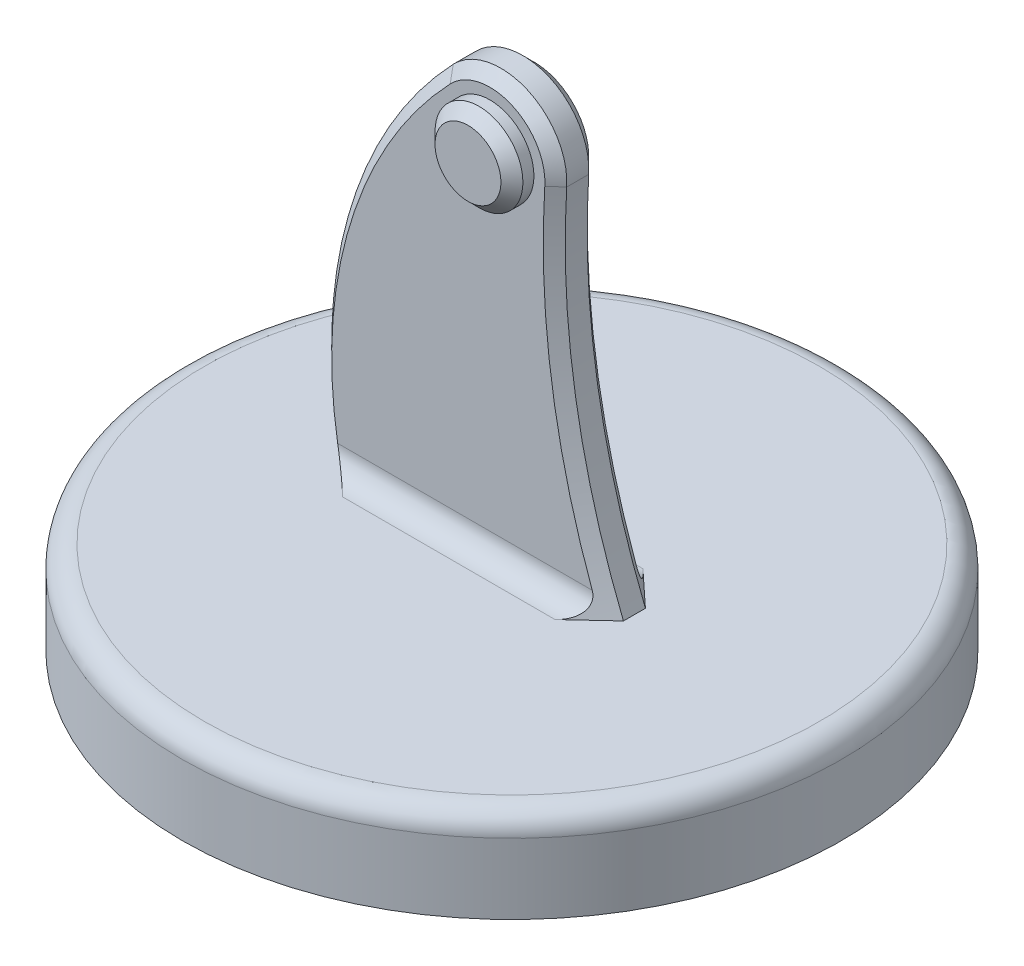
ISO-10303-21;
HEADER;
FILE_DESCRIPTION(('STEP AP214'),'2;1');
FILE_NAME('part.step','',(''),(''),'','','');
FILE_SCHEMA(('AUTOMOTIVE_DESIGN { 1 0 10303 214 1 1 1 1 }'));
ENDSEC;
DATA;
#1=APPLICATION_CONTEXT('core data for automotive mechanical design processes');
#2=APPLICATION_PROTOCOL_DEFINITION('international standard','automotive_design',2000,#1);
#3=PRODUCT_CONTEXT('',#1,'mechanical');
#4=PRODUCT('Part','Part','',(#3));
#5=PRODUCT_RELATED_PRODUCT_CATEGORY('part','',(#4));
#6=PRODUCT_DEFINITION_FORMATION('','',#4);
#7=PRODUCT_DEFINITION_CONTEXT('part definition',#1,'design');
#8=PRODUCT_DEFINITION('design','',#6,#7);
#9=PRODUCT_DEFINITION_SHAPE('','',#8);
#10=(LENGTH_UNIT() NAMED_UNIT(*) SI_UNIT(.MILLI.,.METRE.));
#11=(NAMED_UNIT(*) PLANE_ANGLE_UNIT() SI_UNIT($,.RADIAN.));
#12=(NAMED_UNIT(*) SI_UNIT($,.STERADIAN.) SOLID_ANGLE_UNIT());
#13=UNCERTAINTY_MEASURE_WITH_UNIT(LENGTH_MEASURE(1.E-05),#10,'distance_accuracy_value','');
#14=(GEOMETRIC_REPRESENTATION_CONTEXT(3) GLOBAL_UNCERTAINTY_ASSIGNED_CONTEXT((#13)) GLOBAL_UNIT_ASSIGNED_CONTEXT((#10,
#11,#12)) REPRESENTATION_CONTEXT('',''));
#15=CARTESIAN_POINT('',(0.,0.,0.));
#16=DIRECTION('',(0.,0.,1.));
#17=DIRECTION('',(1.,0.,0.));
#18=AXIS2_PLACEMENT_3D('',#15,#16,#17);
#19=CARTESIAN_POINT('',(0.,20.,0.));
#20=DIRECTION('',(0.,1.,0.));
#21=DIRECTION('',(0.,0.,1.));
#22=AXIS2_PLACEMENT_3D('',#19,#20,#21);
#23=PLANE('',#22);
#24=CARTESIAN_POINT('',(0.,20.,0.));
#25=DIRECTION('',(0.,1.,0.));
#26=DIRECTION('',(0.,0.,1.));
#27=AXIS2_PLACEMENT_3D('',#24,#25,#26);
#28=CIRCLE('',#27,70.);
#29=CARTESIAN_POINT('',(0.,20.,70.));
#30=VERTEX_POINT('',#29);
#31=EDGE_CURVE('E384',#30,#30,#28,.T.);
#32=ORIENTED_EDGE('',*,*,#31,.T.);
#33=EDGE_LOOP('',(#32));
#34=FACE_BOUND('',#33,.T.);
#35=DIRECTION('',(-1.,0.,0.));
#36=VECTOR('',#35,1.);
#37=CARTESIAN_POINT('',(0.,20.,10.));
#38=LINE('',#37,#36);
#39=CARTESIAN_POINT('',(19.8084097202197,20.,10.));
#40=VERTEX_POINT('',#39);
#41=CARTESIAN_POINT('',(-28.5347400447898,20.,10.));
#42=VERTEX_POINT('',#41);
#43=EDGE_CURVE('E137',#40,#42,#38,.T.);
#44=ORIENTED_EDGE('',*,*,#43,.T.);
#45=CARTESIAN_POINT('',(-28.5347400447898,20.,9.99999999999999));
#46=CARTESIAN_POINT('',(-29.390461949538,20.,9.16727790608721));
#47=CARTESIAN_POINT('',(-30.2458713230868,20.,8.33423473892486));
#48=CARTESIAN_POINT('',(-31.9561089872227,20.,6.6675526869515));
#49=CARTESIAN_POINT('',(-32.8109372780004,20.,5.83391380233608));
#50=CARTESIAN_POINT('',(-34.5191891841924,20.,4.16693335697093));
#51=CARTESIAN_POINT('',(-35.372613344394,20.,3.33359235450626));
#52=CARTESIAN_POINT('',(-36.2257918410724,20.,2.50000000000007));
#53=B_SPLINE_CURVE_WITH_KNOTS('',3,(#45,#46,#47,#48,#49,#50,#51,#52),.UNSPECIFIED.,.F.,.F.,(4,2,
2,4),(0.,3.58206271115794,7.16412424671796,10.7425468249186),.UNSPECIFIED.);
#54=CARTESIAN_POINT('',(-36.2257918410724,20.,2.50000000000006));
#55=VERTEX_POINT('',#54);
#56=EDGE_CURVE('E133',#42,#55,#53,.T.);
#57=ORIENTED_EDGE('',*,*,#56,.T.);
#58=DIRECTION('',(0.,0.,-1.));
#59=VECTOR('',#58,1.);
#60=CARTESIAN_POINT('',(-36.2257918410724,20.,5.));
#61=LINE('',#60,#59);
#62=CARTESIAN_POINT('',(-36.2257918410724,20.,-2.49999999999989));
#63=VERTEX_POINT('',#62);
#64=EDGE_CURVE('E135',#55,#63,#61,.T.);
#65=ORIENTED_EDGE('',*,*,#64,.T.);
#66=CARTESIAN_POINT('',(-36.2257918410724,20.,-2.49999999999989));
#67=CARTESIAN_POINT('',(-35.372613344394,20.,-3.33359235450615));
#68=CARTESIAN_POINT('',(-34.5191891841923,20.,-4.16693335697088));
#69=CARTESIAN_POINT('',(-32.8109372780018,20.,-5.83391380233447));
#70=CARTESIAN_POINT('',(-31.9561089872258,20.,-6.66755268694828));
#71=CARTESIAN_POINT('',(-30.2458713230932,20.,-8.33423473891841));
#72=CARTESIAN_POINT('',(-29.390461949546,20.,-9.16727790607914));
#73=CARTESIAN_POINT('',(-28.5347400447995,20.,-9.99999999999032));
#74=B_SPLINE_CURVE_WITH_KNOTS('',3,(#66,#67,#68,#69,#70,#71,#72,#73),.UNSPECIFIED.,.F.,.F.,(4,2,
2,4),(0.,3.57842257820087,7.16048411375398,10.742546824905),.UNSPECIFIED.);
#75=CARTESIAN_POINT('',(-28.5347400447995,20.,-10.));
#76=VERTEX_POINT('',#75);
#77=EDGE_CURVE('E198',#63,#76,#74,.T.);
#78=ORIENTED_EDGE('',*,*,#77,.T.);
#79=DIRECTION('',(-1.,0.,0.));
#80=VECTOR('',#79,1.);
#81=CARTESIAN_POINT('',(25.1824752050034,20.,-10.));
#82=LINE('',#81,#80);
#83=CARTESIAN_POINT('',(19.8084097202194,20.,-10.));
#84=VERTEX_POINT('',#83);
#85=EDGE_CURVE('E338',#76,#84,#82,.F.);
#86=ORIENTED_EDGE('',*,*,#85,.T.);
#87=CARTESIAN_POINT('',(19.8084097202194,20.,-10.));
#88=CARTESIAN_POINT('',(20.7032286114693,20.,-9.16574365323037));
#89=CARTESIAN_POINT('',(21.5984643871195,20.,-8.3319343297424));
#90=CARTESIAN_POINT('',(23.3898068938442,20.,-6.6652533617684));
#91=CARTESIAN_POINT('',(24.2859136241592,20.,-5.83238171646611));
#92=CARTESIAN_POINT('',(26.0805990637616,20.,-4.16616784041946));
#93=CARTESIAN_POINT('',(26.979179359604,20.,-3.33282731858586));
#94=CARTESIAN_POINT('',(27.8782351753599,20.,-2.49999999999989));
#95=B_SPLINE_CURVE_WITH_KNOTS('',3,(#87,#88,#89,#90,#91,#92,#93,#94),.UNSPECIFIED.,.F.,.F.,(4,2,
2,4),(0.,3.67017170974667,7.34034022201683,11.016904082169),.UNSPECIFIED.);
#96=CARTESIAN_POINT('',(27.87823517536,20.,-2.49999999999989));
#97=VERTEX_POINT('',#96);
#98=EDGE_CURVE('E143',#84,#97,#95,.T.);
#99=ORIENTED_EDGE('',*,*,#98,.T.);
#100=DIRECTION('',(0.,0.,-1.));
#101=VECTOR('',#100,1.);
#102=CARTESIAN_POINT('',(27.87823517536,20.,5.));
#103=LINE('',#102,#101);
#104=CARTESIAN_POINT('',(27.87823517536,20.,2.50000000000006));
#105=VERTEX_POINT('',#104);
#106=EDGE_CURVE('E154',#97,#105,#103,.F.);
#107=ORIENTED_EDGE('',*,*,#106,.T.);
#108=CARTESIAN_POINT('',(27.8782351753599,20.,2.50000000000006));
#109=CARTESIAN_POINT('',(26.979179359604,20.,3.33282731858597));
#110=CARTESIAN_POINT('',(26.0805990637617,20.,4.16616784041951));
#111=CARTESIAN_POINT('',(24.2859136241594,20.,5.83238171646611));
#112=CARTESIAN_POINT('',(23.3898068938445,20.,6.6652533617684));
#113=CARTESIAN_POINT('',(21.5984643871198,20.,8.33193432974238));
#114=CARTESIAN_POINT('',(20.7032286114696,20.,9.16574365323035));
#115=CARTESIAN_POINT('',(19.8084097202197,20.,9.99999999999999));
#116=B_SPLINE_CURVE_WITH_KNOTS('',3,(#108,#109,#110,#111,#112,#113,#114,#115),.UNSPECIFIED.,.F.,
.F.,(4,2,2,4),(0.,3.67656386015191,7.34673237242202,11.0169040821687),.UNSPECIFIED.);
#117=EDGE_CURVE('E142',#105,#40,#116,.T.);
#118=ORIENTED_EDGE('',*,*,#117,.T.);
#119=EDGE_LOOP('',(#44,#57,#65,#78,#86,#99,#107,#118));
#120=FACE_BOUND('',#119,.T.);
#121=ADVANCED_FACE('F51',(#34,#120),#23,.T.);
#122=CARTESIAN_POINT('',(0.,-1.,0.));
#123=DIRECTION('',(0.,1.,0.));
#124=DIRECTION('',(0.,0.,1.));
#125=AXIS2_PLACEMENT_3D('',#122,#123,#124);
#126=CYLINDRICAL_SURFACE('',#125,75.);
#127=CARTESIAN_POINT('',(0.,15.,0.));
#128=DIRECTION('',(0.,1.,0.));
#129=DIRECTION('',(0.,0.,1.));
#130=AXIS2_PLACEMENT_3D('',#127,#128,#129);
#131=CIRCLE('',#130,75.);
#132=CARTESIAN_POINT('',(0.,15.,75.));
#133=VERTEX_POINT('',#132);
#134=EDGE_CURVE('E392',#133,#133,#131,.F.);
#135=ORIENTED_EDGE('',*,*,#134,.T.);
#136=EDGE_LOOP('',(#135));
#137=FACE_BOUND('',#136,.T.);
#138=CARTESIAN_POINT('',(0.,-1.,0.));
#139=DIRECTION('',(0.,1.,0.));
#140=DIRECTION('',(0.,0.,1.));
#141=AXIS2_PLACEMENT_3D('',#138,#139,#140);
#142=CIRCLE('',#141,75.);
#143=CARTESIAN_POINT('',(0.,-1.,75.));
#144=VERTEX_POINT('',#143);
#145=EDGE_CURVE('E379',#144,#144,#142,.T.);
#146=ORIENTED_EDGE('',*,*,#145,.T.);
#147=EDGE_LOOP('',(#146));
#148=FACE_BOUND('',#147,.T.);
#149=ADVANCED_FACE('F221',(#137,#148),#126,.T.);
#150=CARTESIAN_POINT('',(0.,-1.,0.));
#151=DIRECTION('',(0.,1.,0.));
#152=DIRECTION('',(0.,0.,1.));
#153=AXIS2_PLACEMENT_3D('',#150,#151,#152);
#154=PLANE('',#153);
#155=ORIENTED_EDGE('',*,*,#145,.F.);
#156=EDGE_LOOP('',(#155));
#157=FACE_BOUND('',#156,.T.);
#158=ADVANCED_FACE('F224',(#157),#154,.F.);
#159=CARTESIAN_POINT('',(0.,15.,0.));
#160=DIRECTION('',(0.,1.,0.));
#161=DIRECTION('',(0.,0.,1.));
#162=AXIS2_PLACEMENT_3D('',#159,#160,#161);
#163=TOROIDAL_SURFACE('',#162,70.,5.);
#164=ORIENTED_EDGE('',*,*,#134,.F.);
#165=EDGE_LOOP('',(#164));
#166=FACE_BOUND('',#165,.T.);
#167=ORIENTED_EDGE('',*,*,#31,.F.);
#168=EDGE_LOOP('',(#167));
#169=FACE_BOUND('',#168,.T.);
#170=ADVANCED_FACE('F442',(#166,#169),#163,.T.);
#171=CARTESIAN_POINT('',(61.4788080980091,41.3028437243492,5.));
#172=DIRECTION('',(0.,0.,-1.));
#173=DIRECTION('',(-1.,0.,0.));
#174=AXIS2_PLACEMENT_3D('',#171,#172,#173);
#175=CYLINDRICAL_SURFACE('',#174,100.);
#176=DIRECTION('',(0.,0.,-1.));
#177=VECTOR('',#176,1.);
#178=CARTESIAN_POINT('',(-10.8492014290604,110.358321695703,5.));
#179=LINE('',#178,#177);
#180=CARTESIAN_POINT('',(-10.8492014290604,110.358321695703,2.50000000000006));
#181=VERTEX_POINT('',#180);
#182=CARTESIAN_POINT('',(-10.8492014290604,110.358321695703,-2.49999999999989));
#183=VERTEX_POINT('',#182);
#184=EDGE_CURVE('E355',#181,#183,#179,.T.);
#185=ORIENTED_EDGE('',*,*,#184,.T.);
#186=CARTESIAN_POINT('',(61.4788080980091,41.3028437243492,-2.49999999999989));
#187=DIRECTION('',(0.,0.,-1.));
#188=DIRECTION('',(-1.,0.,0.));
#189=AXIS2_PLACEMENT_3D('',#186,#187,#188);
#190=CIRCLE('',#189,100.);
#191=EDGE_CURVE('E152',#183,#63,#190,.F.);
#192=ORIENTED_EDGE('',*,*,#191,.T.);
#193=ORIENTED_EDGE('',*,*,#64,.F.);
#194=CARTESIAN_POINT('',(61.4788080980091,41.3028437243492,2.50000000000006));
#195=DIRECTION('',(0.,0.,-1.));
#196=DIRECTION('',(-1.,0.,0.));
#197=AXIS2_PLACEMENT_3D('',#194,#195,#196);
#198=CIRCLE('',#197,100.);
#199=EDGE_CURVE('E149',#55,#181,#198,.T.);
#200=ORIENTED_EDGE('',*,*,#199,.T.);
#201=EDGE_LOOP('',(#185,#192,#193,#200));
#202=FACE_BOUND('',#201,.T.);
#203=ADVANCED_FACE('F148',(#202),#175,.T.);
#204=CARTESIAN_POINT('',(194.618391581677,87.8064911464742,5.));
#205=DIRECTION('',(0.,0.,-1.));
#206=DIRECTION('',(-1.,0.,0.));
#207=AXIS2_PLACEMENT_3D('',#204,#205,#206);
#208=CYLINDRICAL_SURFACE('',#207,180.);
#209=ORIENTED_EDGE('',*,*,#106,.F.);
#210=CARTESIAN_POINT('',(194.618391581677,87.8064911464742,-2.49999999999989));
#211=DIRECTION('',(0.,0.,-1.));
#212=DIRECTION('',(-1.,0.,0.));
#213=AXIS2_PLACEMENT_3D('',#210,#211,#212);
#214=CIRCLE('',#213,180.);
#215=CARTESIAN_POINT('',(14.9706455062829,99.062037780498,-2.49999999999989));
#216=VERTEX_POINT('',#215);
#217=EDGE_CURVE('E185',#97,#216,#214,.T.);
#218=ORIENTED_EDGE('',*,*,#217,.T.);
#219=DIRECTION('',(0.,0.,-1.));
#220=VECTOR('',#219,1.);
#221=CARTESIAN_POINT('',(14.9706455062829,99.062037780498,5.));
#222=LINE('',#221,#220);
#223=CARTESIAN_POINT('',(14.9706455062829,99.062037780498,2.50000000000006));
#224=VERTEX_POINT('',#223);
#225=EDGE_CURVE('E373',#224,#216,#222,.T.);
#226=ORIENTED_EDGE('',*,*,#225,.F.);
#227=CARTESIAN_POINT('',(194.618391581677,87.8064911464742,2.50000000000006));
#228=DIRECTION('',(0.,0.,-1.));
#229=DIRECTION('',(-1.,0.,0.));
#230=AXIS2_PLACEMENT_3D('',#227,#228,#229);
#231=CIRCLE('',#230,180.);
#232=EDGE_CURVE('E182',#224,#105,#231,.F.);
#233=ORIENTED_EDGE('',*,*,#232,.T.);
#234=EDGE_LOOP('',(#209,#218,#226,#233));
#235=FACE_BOUND('',#234,.T.);
#236=ADVANCED_FACE('F372',(#235),#208,.F.);
#237=CARTESIAN_POINT('',(0.,100.,5.));
#238=DIRECTION('',(0.,0.,-1.));
#239=DIRECTION('',(-1.,0.,0.));
#240=AXIS2_PLACEMENT_3D('',#237,#238,#239);
#241=CYLINDRICAL_SURFACE('',#240,15.);
#242=ORIENTED_EDGE('',*,*,#225,.T.);
#243=CARTESIAN_POINT('',(0.,100.,-2.49999999999989));
#244=DIRECTION('',(0.,0.,-1.));
#245=DIRECTION('',(-1.,0.,0.));
#246=AXIS2_PLACEMENT_3D('',#243,#244,#245);
#247=CIRCLE('',#246,15.);
#248=EDGE_CURVE('E179',#216,#183,#247,.F.);
#249=ORIENTED_EDGE('',*,*,#248,.T.);
#250=ORIENTED_EDGE('',*,*,#184,.F.);
#251=CARTESIAN_POINT('',(0.,100.,2.50000000000005));
#252=DIRECTION('',(0.,0.,-1.));
#253=DIRECTION('',(-1.,0.,0.));
#254=AXIS2_PLACEMENT_3D('',#251,#252,#253);
#255=CIRCLE('',#254,15.);
#256=EDGE_CURVE('E176',#181,#224,#255,.T.);
#257=ORIENTED_EDGE('',*,*,#256,.T.);
#258=EDGE_LOOP('',(#242,#249,#250,#257));
#259=FACE_BOUND('',#258,.T.);
#260=ADVANCED_FACE('F327',(#259),#241,.T.);
#261=CARTESIAN_POINT('',(61.4788080980091,41.3028437243492,5.));
#262=DIRECTION('',(0.,0.,-1.));
#263=DIRECTION('',(-1.,0.,0.));
#264=AXIS2_PLACEMENT_3D('',#261,#262,#263);
#265=PLANE('',#264);
#266=CARTESIAN_POINT('',(0.,100.,5.));
#267=DIRECTION('',(0.,0.,-1.));
#268=DIRECTION('',(-1.,0.,0.));
#269=AXIS2_PLACEMENT_3D('',#266,#267,#268);
#270=CIRCLE('',#269,10.);
#271=CARTESIAN_POINT('',(-10.,100.,5.));
#272=VERTEX_POINT('',#271);
#273=EDGE_CURVE('E295',#272,#272,#270,.F.);
#274=ORIENTED_EDGE('',*,*,#273,.F.);
#275=EDGE_LOOP('',(#274));
#276=FACE_BOUND('',#275,.T.);
#277=CARTESIAN_POINT('',(61.4788080980091,41.3028437243492,5.));
#278=DIRECTION('',(0.,0.,-1.));
#279=DIRECTION('',(-1.,0.,0.));
#280=AXIS2_PLACEMENT_3D('',#277,#278,#279);
#281=CIRCLE('',#280,97.5);
#282=CARTESIAN_POINT('',(-9.04100119088375,108.631934746419,5.));
#283=VERTEX_POINT('',#282);
#284=CARTESIAN_POINT('',(-34.6485412178826,25.,5.));
#285=VERTEX_POINT('',#284);
#286=EDGE_CURVE('E194',#283,#285,#281,.F.);
#287=ORIENTED_EDGE('',*,*,#286,.T.);
#288=DIRECTION('',(-1.,0.,0.));
#289=VECTOR('',#288,1.);
#290=CARTESIAN_POINT('',(61.4788080980091,25.,5.));
#291=LINE('',#290,#289);
#292=CARTESIAN_POINT('',(23.2661384016625,25.,5.));
#293=VERTEX_POINT('',#292);
#294=EDGE_CURVE('E330',#285,#293,#291,.F.);
#295=ORIENTED_EDGE('',*,*,#294,.T.);
#296=CARTESIAN_POINT('',(194.618391581677,87.8064911464742,5.));
#297=DIRECTION('',(0.,0.,-1.));
#298=DIRECTION('',(-1.,0.,0.));
#299=AXIS2_PLACEMENT_3D('',#296,#297,#298);
#300=CIRCLE('',#299,182.5);
#301=CARTESIAN_POINT('',(12.4755379219025,99.2183648170817,5.));
#302=VERTEX_POINT('',#301);
#303=EDGE_CURVE('E188',#293,#302,#300,.T.);
#304=ORIENTED_EDGE('',*,*,#303,.T.);
#305=CARTESIAN_POINT('',(0.,100.,5.));
#306=DIRECTION('',(0.,0.,-1.));
#307=DIRECTION('',(-1.,0.,0.));
#308=AXIS2_PLACEMENT_3D('',#305,#306,#307);
#309=CIRCLE('',#308,12.5000000000001);
#310=EDGE_CURVE('E191',#302,#283,#309,.F.);
#311=ORIENTED_EDGE('',*,*,#310,.T.);
#312=EDGE_LOOP('',(#287,#295,#304,#311));
#313=FACE_BOUND('',#312,.T.);
#314=ADVANCED_FACE('F323',(#276,#313),#265,.F.);
#315=CARTESIAN_POINT('',(61.4788080980091,41.3028437243492,-5.));
#316=DIRECTION('',(0.,0.,-1.));
#317=DIRECTION('',(-1.,0.,0.));
#318=AXIS2_PLACEMENT_3D('',#315,#316,#317);
#319=PLANE('',#318);
#320=CARTESIAN_POINT('',(0.,100.,-5.));
#321=DIRECTION('',(0.,0.,-1.));
#322=DIRECTION('',(-1.,0.,0.));
#323=AXIS2_PLACEMENT_3D('',#320,#321,#322);
#324=CIRCLE('',#323,5.);
#325=CARTESIAN_POINT('',(-5.,100.,-5.));
#326=VERTEX_POINT('',#325);
#327=EDGE_CURVE('E571',#326,#326,#324,.T.);
#328=ORIENTED_EDGE('',*,*,#327,.F.);
#329=EDGE_LOOP('',(#328));
#330=FACE_BOUND('',#329,.T.);
#331=CARTESIAN_POINT('',(194.618391581677,87.8064911464742,-5.));
#332=DIRECTION('',(0.,0.,-1.));
#333=DIRECTION('',(-1.,0.,0.));
#334=AXIS2_PLACEMENT_3D('',#331,#332,#333);
#335=CIRCLE('',#334,182.5);
#336=CARTESIAN_POINT('',(12.4755379219023,99.2183648170817,-5.));
#337=VERTEX_POINT('',#336);
#338=CARTESIAN_POINT('',(23.2661384016622,25.,-5.));
#339=VERTEX_POINT('',#338);
#340=EDGE_CURVE('E164',#337,#339,#335,.F.);
#341=ORIENTED_EDGE('',*,*,#340,.T.);
#342=DIRECTION('',(-1.,0.,0.));
#343=VECTOR('',#342,1.);
#344=CARTESIAN_POINT('',(-33.665497297826,25.,-5.));
#345=LINE('',#344,#343);
#346=CARTESIAN_POINT('',(-34.6485412178824,25.,-5.));
#347=VERTEX_POINT('',#346);
#348=EDGE_CURVE('E265',#339,#347,#345,.T.);
#349=ORIENTED_EDGE('',*,*,#348,.T.);
#350=CARTESIAN_POINT('',(61.4788080980091,41.3028437243492,-5.));
#351=DIRECTION('',(0.,0.,-1.));
#352=DIRECTION('',(-1.,0.,0.));
#353=AXIS2_PLACEMENT_3D('',#350,#351,#352);
#354=CIRCLE('',#353,97.4999999999999);
#355=CARTESIAN_POINT('',(-9.04100119088361,108.631934746419,-5.));
#356=VERTEX_POINT('',#355);
#357=EDGE_CURVE('E173',#347,#356,#354,.T.);
#358=ORIENTED_EDGE('',*,*,#357,.T.);
#359=CARTESIAN_POINT('',(0.,100.,-5.));
#360=DIRECTION('',(0.,0.,-1.));
#361=DIRECTION('',(-1.,0.,0.));
#362=AXIS2_PLACEMENT_3D('',#359,#360,#361);
#363=CIRCLE('',#362,12.4999999999999);
#364=EDGE_CURVE('E170',#356,#337,#363,.T.);
#365=ORIENTED_EDGE('',*,*,#364,.T.);
#366=EDGE_LOOP('',(#341,#349,#358,#365));
#367=FACE_BOUND('',#366,.T.);
#368=ADVANCED_FACE('F326',(#330,#367),#319,.T.);
#369=CARTESIAN_POINT('',(194.618391581677,87.8064911464742,-2.49999999999989));
#370=DIRECTION('',(0.,0.,-1.));
#371=DIRECTION('',(-1.,0.,0.));
#372=AXIS2_PLACEMENT_3D('',#369,#370,#371);
#373=CONICAL_SURFACE('',#372,180.,0.785398163397448);
#374=ORIENTED_EDGE('',*,*,#98,.F.);
#375=CARTESIAN_POINT('',(19.8084097202194,20.,-10.));
#376=CARTESIAN_POINT('',(19.9616222001358,20.0000298804788,-9.85714704113473));
#377=CARTESIAN_POINT('',(20.113792401427,20.0061250464787,-9.71309524720428));
#378=CARTESIAN_POINT('',(20.4154099258561,20.0312732005136,-9.42286389259006));
#379=CARTESIAN_POINT('',(20.5648530266056,20.0503447774578,-9.2766815742706));
#380=CARTESIAN_POINT('',(20.8615528966933,20.102562652016,-8.98125926298964));
#381=CARTESIAN_POINT('',(21.0087676549954,20.1358611613083,-8.83200332023087));
#382=CARTESIAN_POINT('',(21.2980316141233,20.2175964036354,-8.5328080602607));
#383=CARTESIAN_POINT('',(21.4400838108924,20.2660241950172,-8.38286919811183));
#384=CARTESIAN_POINT('',(21.7828151280984,20.4058352198909,-8.01276165533596));
#385=CARTESIAN_POINT('',(21.9797828513874,20.5067135935973,-7.79259954802386));
#386=CARTESIAN_POINT('',(22.3528762269485,20.7482032050806,-7.35729519112309));
#387=CARTESIAN_POINT('',(22.5290705137556,20.8886780845711,-7.14213841034353));
#388=CARTESIAN_POINT('',(22.8168193138975,21.1785477540737,-6.76898245708678));
#389=CARTESIAN_POINT('',(22.9340909878661,21.319317167827,-6.60875060095628));
#390=CARTESIAN_POINT('',(23.1447782575428,21.6294430522973,-6.30040897895643));
#391=CARTESIAN_POINT('',(23.2382153446301,21.7987735392682,-6.15228837499194));
#392=CARTESIAN_POINT('',(23.3804737185193,22.1320581970212,-5.8999510494132));
#393=CARTESIAN_POINT('',(23.4342962789319,22.2915049540279,-5.79262885058203));
#394=CARTESIAN_POINT('',(23.5179262343762,22.6263855761311,-5.59504489142649));
#395=CARTESIAN_POINT('',(23.5477623016993,22.8018000739712,-5.50476286123897));
#396=CARTESIAN_POINT('',(23.5813327898912,23.1648092903734,-5.34473112728065));
#397=CARTESIAN_POINT('',(23.5849884501375,23.3524390501042,-5.27504398310996));
#398=CARTESIAN_POINT('',(23.5658130806124,23.733709875505,-5.15889768650512));
#399=CARTESIAN_POINT('',(23.5429456120537,23.9273588546123,-5.11247061551666));
#400=CARTESIAN_POINT('',(23.4808763212379,24.2692712797722,-5.05137708232072));
#401=CARTESIAN_POINT('',(23.4467017445588,24.4176298806951,-5.03183845273443));
#402=CARTESIAN_POINT('',(23.385826639903,24.63802725972,-5.01257591131647));
#403=CARTESIAN_POINT('',(23.3639728403136,24.7110279587234,-5.00782892798884));
#404=CARTESIAN_POINT('',(23.3172604092297,24.8561887780631,-5.00154052901006));
#405=CARTESIAN_POINT('',(23.2924023157313,24.9283490463701,-4.99999854031963));
#406=CARTESIAN_POINT('',(23.2661384016623,25.,-4.99999999999999));
#407=B_SPLINE_CURVE_WITH_KNOTS('',3,(#375,#376,#377,#378,#379,#380,#381,#382,#383,#384,#385,
#386,#387,#388,#389,#390,#391,#392,#393,#394,#395,#396,#397,#398,#399,#400,#401,#402,#403,#404,
#405,#406),.UNSPECIFIED.,.F.,.F.,(4,2,2,2,2,2,2,2,2,2,2,2,2,2,2,4),(0.,0.628421039599247,
1.25774420264553,1.89397597557041,2.52983243422467,3.46357701051968,4.39414453597985,
5.12178326458136,5.84876355163269,6.44503340286867,7.04058943781575,7.6379363821026,
8.23610496423004,8.69534624701097,8.92427835401007,9.15316952540915),.UNSPECIFIED.);
#408=EDGE_CURVE('E68',#84,#339,#407,.T.);
#409=ORIENTED_EDGE('',*,*,#408,.T.);
#410=ORIENTED_EDGE('',*,*,#340,.F.);
#411=DIRECTION('',(-0.705722997082167,0.0442159630604447,-0.707106781186549));
#412=VECTOR('',#411,1.);
#413=CARTESIAN_POINT('',(14.9706455062829,99.062037780498,-2.49999999999989));
#414=LINE('',#413,#412);
#415=EDGE_CURVE('E352',#216,#337,#414,.T.);
#416=ORIENTED_EDGE('',*,*,#415,.F.);
#417=ORIENTED_EDGE('',*,*,#217,.F.);
#418=EDGE_LOOP('',(#374,#409,#410,#416,#417));
#419=FACE_BOUND('',#418,.T.);
#420=ADVANCED_FACE('F251',(#419),#373,.F.);
#421=CARTESIAN_POINT('',(0.,100.,-2.49999999999989));
#422=DIRECTION('',(0.,0.,1.));
#423=DIRECTION('',(1.,0.,0.));
#424=AXIS2_PLACEMENT_3D('',#421,#422,#423);
#425=CONICAL_SURFACE('',#424,15.,0.785398163397452);
#426=ORIENTED_EDGE('',*,*,#415,.T.);
#427=ORIENTED_EDGE('',*,*,#364,.F.);
#428=DIRECTION('',(0.511436260063162,-0.488295967516228,-0.707106781186545));
#429=VECTOR('',#428,1.);
#430=CARTESIAN_POINT('',(-10.8492014290604,110.358321695703,-2.49999999999989));
#431=LINE('',#430,#429);
#432=EDGE_CURVE('E348',#183,#356,#431,.T.);
#433=ORIENTED_EDGE('',*,*,#432,.F.);
#434=ORIENTED_EDGE('',*,*,#248,.F.);
#435=EDGE_LOOP('',(#426,#427,#433,#434));
#436=FACE_BOUND('',#435,.T.);
#437=ADVANCED_FACE('F364',(#436),#425,.T.);
#438=CARTESIAN_POINT('',(61.4788080980091,41.3028437243492,-2.49999999999989));
#439=DIRECTION('',(0.,0.,1.));
#440=DIRECTION('',(1.,0.,0.));
#441=AXIS2_PLACEMENT_3D('',#438,#439,#440);
#442=CONICAL_SURFACE('',#441,100.,0.785398163397451);
#443=ORIENTED_EDGE('',*,*,#432,.T.);
#444=ORIENTED_EDGE('',*,*,#357,.F.);
#445=CARTESIAN_POINT('',(-34.6485412178824,25.,-5.));
#446=CARTESIAN_POINT('',(-34.6278263931645,24.8776737195309,-4.99997205696549));
#447=CARTESIAN_POINT('',(-34.6024065399031,24.7562262915276,-5.00448739117207));
#448=CARTESIAN_POINT('',(-34.5429849208854,24.5162780856462,-5.02201019394859));
#449=CARTESIAN_POINT('',(-34.5089975298438,24.3977727337697,-5.03500349551893));
#450=CARTESIAN_POINT('',(-34.4336064530606,24.1657504184647,-5.06870753536354));
#451=CARTESIAN_POINT('',(-34.3922873438697,24.0521932495797,-5.08933290323475));
#452=CARTESIAN_POINT('',(-34.302818666344,23.8293395597508,-5.13763804893629));
#453=CARTESIAN_POINT('',(-34.2546663483713,23.7200447766429,-5.16532067014758));
#454=CARTESIAN_POINT('',(-34.101899987464,23.4007855163625,-5.25749953763443));
#455=CARTESIAN_POINT('',(-33.9883894250088,23.1977010164338,-5.33139897333395));
#456=CARTESIAN_POINT('',(-33.7431081280648,22.8114075187661,-5.49947966844371));
#457=CARTESIAN_POINT('',(-33.6112792288647,22.6282652833932,-5.59372608368114));
#458=CARTESIAN_POINT('',(-33.3597715899797,22.3143795242672,-5.77930779563057));
#459=CARTESIAN_POINT('',(-33.2423430904441,22.1802045011359,-5.86796813176538));
#460=CARTESIAN_POINT('',(-33.0003701704357,21.9250062885372,-6.05419427532001));
#461=CARTESIAN_POINT('',(-32.8758222627858,21.803989629899,-6.15176446112315));
#462=CARTESIAN_POINT('',(-32.6209581839139,21.574515672378,-6.35451763345837));
#463=CARTESIAN_POINT('',(-32.4906317175556,21.4660821453441,-6.45971443821715));
#464=CARTESIAN_POINT('',(-32.2256565914917,21.261571364397,-6.67639624695992));
#465=CARTESIAN_POINT('',(-32.091008151286,21.1654934842151,-6.78788093181872));
#466=CARTESIAN_POINT('',(-31.7670829795189,20.9513521781691,-7.0591623462626));
#467=CARTESIAN_POINT('',(-31.5762977372454,20.8386006241572,-7.22136644551832));
#468=CARTESIAN_POINT('',(-31.1903799013299,20.6347373401019,-7.55407285197029));
#469=CARTESIAN_POINT('',(-30.995245384709,20.543635398434,-7.7245788708709));
#470=CARTESIAN_POINT('',(-30.6024455629514,20.3825905264103,-8.07225279463921));
#471=CARTESIAN_POINT('',(-30.4047817757242,20.312635473578,-8.24941681705511));
#472=CARTESIAN_POINT('',(-30.0083154260171,20.1935947017099,-8.60919264195971));
#473=CARTESIAN_POINT('',(-29.8095134145845,20.144499628215,-8.79180196315536));
#474=CARTESIAN_POINT('',(-29.4304409321058,20.0707858186542,-9.14430295407238));
#475=CARTESIAN_POINT('',(-29.2501629713123,20.0443183217429,-9.31380200505617));
#476=CARTESIAN_POINT('',(-28.8911755946429,20.0089730286601,-9.65518491269284));
#477=CARTESIAN_POINT('',(-28.7124631020954,20.0000429318062,-9.82706013433484));
#478=CARTESIAN_POINT('',(-28.5347400447948,20.,-9.99999999999492));
#479=B_SPLINE_CURVE_WITH_KNOTS('',3,(#445,#446,#447,#448,#449,#450,#451,#452,#453,#454,#455,
#456,#457,#458,#459,#460,#461,#462,#463,#464,#465,#466,#467,#468,#469,#470,#471,#472,#473,#474,
#475,#476,#477,#478),.UNSPECIFIED.,.F.,.F.,(4,2,2,2,2,2,2,2,2,2,2,2,2,2,2,2,4),(0.,
0.371910340457605,0.74320079101391,1.11045779196236,1.47786299596239,2.20715942536886,
2.93882682183087,3.535412288619,4.13229251712418,4.7302826111616,5.32824238300983,
6.15097947183996,6.97408783764379,7.79672345698739,8.61898978287112,9.36494146338211,
10.1086651405441),.UNSPECIFIED.);
#480=EDGE_CURVE('E76',#347,#76,#479,.T.);
#481=ORIENTED_EDGE('',*,*,#480,.T.);
#482=ORIENTED_EDGE('',*,*,#77,.F.);
#483=ORIENTED_EDGE('',*,*,#191,.F.);
#484=EDGE_LOOP('',(#443,#444,#481,#482,#483));
#485=FACE_BOUND('',#484,.T.);
#486=ADVANCED_FACE('F213',(#485),#442,.T.);
#487=CARTESIAN_POINT('',(194.618391581677,87.8064911464742,5.));
#488=DIRECTION('',(0.,0.,1.));
#489=DIRECTION('',(1.,0.,0.));
#490=AXIS2_PLACEMENT_3D('',#487,#488,#489);
#491=CONICAL_SURFACE('',#490,182.5,0.785398163397443);
#492=ORIENTED_EDGE('',*,*,#117,.F.);
#493=ORIENTED_EDGE('',*,*,#232,.F.);
#494=DIRECTION('',(0.705722997082166,-0.0442159630604437,-0.70710678118655));
#495=VECTOR('',#494,1.);
#496=CARTESIAN_POINT('',(12.4755379219025,99.2183648170817,5.));
#497=LINE('',#496,#495);
#498=EDGE_CURVE('E344',#302,#224,#497,.T.);
#499=ORIENTED_EDGE('',*,*,#498,.F.);
#500=ORIENTED_EDGE('',*,*,#303,.F.);
#501=CARTESIAN_POINT('',(23.2661384016625,25.,5.));
#502=CARTESIAN_POINT('',(23.3002005671834,24.9070970588888,4.99998982101167));
#503=CARTESIAN_POINT('',(23.331900365859,24.8132947634358,5.00258916549921));
#504=CARTESIAN_POINT('',(23.3901604515584,24.6243431264429,5.01323591479231));
#505=CARTESIAN_POINT('',(23.4167170425788,24.5291928685387,5.02128721893148));
#506=CARTESIAN_POINT('',(23.4642590261446,24.3379983044757,5.04308274610182));
#507=CARTESIAN_POINT('',(23.4852365999853,24.2419529368185,5.0568348902683));
#508=CARTESIAN_POINT('',(23.5211837982654,24.0497650147842,5.09015681555102));
#509=CARTESIAN_POINT('',(23.5361548951621,23.9536224900254,5.10972516880294));
#510=CARTESIAN_POINT('',(23.5598434730771,23.7615087850931,5.15480488443815));
#511=CARTESIAN_POINT('',(23.5685335526407,23.6655401561134,5.18034165170114));
#512=CARTESIAN_POINT('',(23.5793589711211,23.4749236099918,5.23722376580067));
#513=CARTESIAN_POINT('',(23.5814919758391,23.3802761751034,5.26857117691084));
#514=CARTESIAN_POINT('',(23.5791344482647,23.1932936963799,5.33677201100209));
#515=CARTESIAN_POINT('',(23.5746576512135,23.1009542616796,5.37361387353918));
#516=CARTESIAN_POINT('',(23.5591775223306,22.9190612464289,5.4525252464123));
#517=CARTESIAN_POINT('',(23.5481717304809,22.8295087293356,5.49459672245527));
#518=CARTESIAN_POINT('',(23.5205328957291,22.6581681393704,5.58133674973437));
#519=CARTESIAN_POINT('',(23.5042028834639,22.5762147571266,5.62577615786905));
#520=CARTESIAN_POINT('',(23.4660960259121,22.4158463901558,5.71855815688247));
#521=CARTESIAN_POINT('',(23.4443173998561,22.3374325721738,5.76690202034879));
#522=CARTESIAN_POINT('',(23.3712669897885,22.1079558946016,5.91717329223246));
#523=CARTESIAN_POINT('',(23.3122859316016,21.9626892734793,6.02432427062645));
#524=CARTESIAN_POINT('',(23.1519246056422,21.6389242665395,6.29030441266749));
#525=CARTESIAN_POINT('',(23.0429297160746,21.4679275550975,6.45361876347933));
#526=CARTESIAN_POINT('',(22.8002588719764,21.1580788280493,6.79181102146746));
#527=CARTESIAN_POINT('',(22.6665421365394,21.0192807927284,6.96670772427778));
#528=CARTESIAN_POINT('',(22.3197638247352,20.7186526437609,7.39885475877633));
#529=CARTESIAN_POINT('',(22.0972299147784,20.5723698914755,7.65932857124401));
#530=CARTESIAN_POINT('',(21.7458214725294,20.3928428518393,8.05194856088026));
#531=CARTESIAN_POINT('',(21.6254999159945,20.3395856596789,8.1833971595542));
#532=CARTESIAN_POINT('',(21.3800348286691,20.2454846645251,8.44627656448098));
#533=CARTESIAN_POINT('',(21.2548922835547,20.2046383390843,8.57770736891523));
#534=CARTESIAN_POINT('',(21.0216039690426,20.1402893934769,8.8184355528657));
#535=CARTESIAN_POINT('',(20.9140295433625,20.115042165326,8.92783397103437));
#536=CARTESIAN_POINT('',(20.6966536902158,20.0722321318853,9.14592246129717));
#537=CARTESIAN_POINT('',(20.5868522553936,20.0546693519809,9.25461253105013));
#538=CARTESIAN_POINT('',(20.3664141647908,20.0269838470988,9.47008454014685));
#539=CARTESIAN_POINT('',(20.2557937252115,20.0167960789621,9.57687485159778));
#540=CARTESIAN_POINT('',(20.0331107499655,20.0033093732439,9.78932326315868));
#541=CARTESIAN_POINT('',(19.9210486204087,20.0000085366556,9.89498166738486));
#542=CARTESIAN_POINT('',(19.8084097202197,20.,10.));
#543=B_SPLINE_CURVE_WITH_KNOTS('',3,(#501,#502,#503,#504,#505,#506,#507,#508,#509,#510,#511,
#512,#513,#514,#515,#516,#517,#518,#519,#520,#521,#522,#523,#524,#525,#526,#527,#528,#529,#530,
#531,#532,#533,#534,#535,#536,#537,#538,#539,#540,#541,#542),.UNSPECIFIED.,.F.,.F.,(4,2,2,2,2,2,
2,2,2,2,2,2,2,2,2,2,2,2,2,2,4),(0.,0.296831377796513,0.593875278954087,0.891333303938983,
1.18871836397786,1.48739308625394,1.78617411897321,2.08433515458885,2.38260860379724,
2.66622794573056,2.94994010430051,3.51747042312951,4.29430082789705,5.072424306823,
6.183418132081,6.74108455291983,7.29863755488186,7.76491483358027,8.23119365260229,
8.69330833935966,9.1552955854791),.UNSPECIFIED.);
#544=EDGE_CURVE('E264',#293,#40,#543,.T.);
#545=ORIENTED_EDGE('',*,*,#544,.T.);
#546=EDGE_LOOP('',(#492,#493,#499,#500,#545));
#547=FACE_BOUND('',#546,.T.);
#548=ADVANCED_FACE('F277',(#547),#491,.F.);
#549=CARTESIAN_POINT('',(0.,100.,5.));
#550=DIRECTION('',(0.,0.,-1.));
#551=DIRECTION('',(-1.,0.,0.));
#552=AXIS2_PLACEMENT_3D('',#549,#550,#551);
#553=CONICAL_SURFACE('',#552,12.5000000000001,0.785398163397445);
#554=ORIENTED_EDGE('',*,*,#498,.T.);
#555=ORIENTED_EDGE('',*,*,#256,.F.);
#556=DIRECTION('',(-0.511436260063158,0.488295967516225,-0.70710678118655));
#557=VECTOR('',#556,1.);
#558=CARTESIAN_POINT('',(-9.04100119088375,108.631934746419,5.));
#559=LINE('',#558,#557);
#560=EDGE_CURVE('E160',#283,#181,#559,.T.);
#561=ORIENTED_EDGE('',*,*,#560,.F.);
#562=ORIENTED_EDGE('',*,*,#310,.F.);
#563=EDGE_LOOP('',(#554,#555,#561,#562));
#564=FACE_BOUND('',#563,.T.);
#565=ADVANCED_FACE('F249',(#564),#553,.T.);
#566=CARTESIAN_POINT('',(61.4788080980091,41.3028437243492,5.));
#567=DIRECTION('',(0.,0.,-1.));
#568=DIRECTION('',(-1.,0.,0.));
#569=AXIS2_PLACEMENT_3D('',#566,#567,#568);
#570=CONICAL_SURFACE('',#569,97.5000000000001,0.785398163397446);
#571=ORIENTED_EDGE('',*,*,#560,.T.);
#572=ORIENTED_EDGE('',*,*,#199,.F.);
#573=ORIENTED_EDGE('',*,*,#56,.F.);
#574=CARTESIAN_POINT('',(-28.5347400447898,20.,10.));
#575=CARTESIAN_POINT('',(-28.6394037298976,20.000005434771,9.89815059591554));
#576=CARTESIAN_POINT('',(-28.7444044701097,20.0031117141702,9.79667872726324));
#577=CARTESIAN_POINT('',(-28.9548959740976,20.015430758412,9.59462953884506));
#578=CARTESIAN_POINT('',(-29.06038670815,20.0246431575365,9.49405216587012));
#579=CARTESIAN_POINT('',(-29.3774210581306,20.0613070700193,9.19377282554193));
#580=CARTESIAN_POINT('',(-29.5894429565537,20.0977851443199,8.99560518423251));
#581=CARTESIAN_POINT('',(-30.0149470348642,20.1948303369437,8.60300164617535));
#582=CARTESIAN_POINT('',(-30.2284255574995,20.2556075268317,8.40861421626865));
#583=CARTESIAN_POINT('',(-30.6533009098755,20.4012836398836,8.02679361368094));
#584=CARTESIAN_POINT('',(-30.864698419037,20.486174400497,7.8393581119736));
#585=CARTESIAN_POINT('',(-31.23581805139,20.6583962515183,7.51482560986987));
#586=CARTESIAN_POINT('',(-31.3963375276234,20.7407622681903,7.37599142315453));
#587=CARTESIAN_POINT('',(-31.7140120771385,20.920552010497,7.1043781144569));
#588=CARTESIAN_POINT('',(-31.8711678474208,21.0179725815724,6.97159773148074));
#589=CARTESIAN_POINT('',(-32.1804856522051,21.2281280967814,6.71357483416337));
#590=CARTESIAN_POINT('',(-32.332660474766,21.340819251485,6.58831219251086));
#591=CARTESIAN_POINT('',(-32.6308687242773,21.5823060586907,6.3464316457991));
#592=CARTESIAN_POINT('',(-32.7769045910205,21.7110952309635,6.22981029212436));
#593=CARTESIAN_POINT('',(-33.1114401131508,22.0342782323158,5.96739519381318));
#594=CARTESIAN_POINT('',(-33.2966353855766,22.2357416578196,5.82592043060814));
#595=CARTESIAN_POINT('',(-33.6456704142066,22.6710303913349,5.56832398351651));
#596=CARTESIAN_POINT('',(-33.8095301722192,22.9048249589202,5.45217848375559));
#597=CARTESIAN_POINT('',(-34.0707148956104,23.3443131711605,5.27769119806797));
#598=CARTESIAN_POINT('',(-34.1745553911899,23.5431850809405,5.21216424392806));
#599=CARTESIAN_POINT('',(-34.312910319224,23.8535368517304,5.13204069721148));
#600=CARTESIAN_POINT('',(-34.356093990183,23.9588861391615,5.10837492195165));
#601=CARTESIAN_POINT('',(-34.4360284136756,24.1732140859586,5.06762637880012));
#602=CARTESIAN_POINT('',(-34.4727823057825,24.2821909429161,5.05054039316327));
#603=CARTESIAN_POINT('',(-34.5357563799721,24.4918108462674,5.02489103654147));
#604=CARTESIAN_POINT('',(-34.5626708259067,24.5921598661021,5.01563242611837));
#605=CARTESIAN_POINT('',(-34.610349029853,24.7948018697914,5.0031760516126));
#606=CARTESIAN_POINT('',(-34.6311052843734,24.8970970648735,4.99998565599897));
#607=CARTESIAN_POINT('',(-34.6485412178826,25.,5.));
#608=B_SPLINE_CURVE_WITH_KNOTS('',3,(#574,#575,#576,#577,#578,#579,#580,#581,#582,#583,#584,
#585,#586,#587,#588,#589,#590,#591,#592,#593,#594,#595,#596,#597,#598,#599,#600,#601,#602,#603,
#604,#605,#606,#607),.UNSPECIFIED.,.F.,.F.,(4,2,2,2,2,2,2,2,2,2,2,2,2,2,2,2,4),(0.,
0.438046358396582,0.876066482945878,1.75245654359022,2.63659295844551,3.52043044513258,
4.20284499036564,4.8851167346073,5.5654718630622,6.24555399245984,7.1667857113255,
8.08714747013587,8.78553853656555,9.13405477040997,9.48240035064392,9.79495848648627,
10.1078959115209),.UNSPECIFIED.);
#609=EDGE_CURVE('E255',#42,#285,#608,.T.);
#610=ORIENTED_EDGE('',*,*,#609,.T.);
#611=ORIENTED_EDGE('',*,*,#286,.F.);
#612=EDGE_LOOP('',(#571,#572,#573,#610,#611));
#613=FACE_BOUND('',#612,.T.);
#614=ADVANCED_FACE('F157',(#613),#570,.T.);
#615=CARTESIAN_POINT('',(0.,25.,10.));
#616=DIRECTION('',(-1.,0.,0.));
#617=DIRECTION('',(0.,0.,1.));
#618=AXIS2_PLACEMENT_3D('',#615,#616,#617);
#619=CYLINDRICAL_SURFACE('',#618,5.);
#620=ORIENTED_EDGE('',*,*,#544,.F.);
#621=ORIENTED_EDGE('',*,*,#294,.F.);
#622=ORIENTED_EDGE('',*,*,#609,.F.);
#623=ORIENTED_EDGE('',*,*,#43,.F.);
#624=EDGE_LOOP('',(#620,#621,#622,#623));
#625=FACE_BOUND('',#624,.T.);
#626=ADVANCED_FACE('F248',(#625),#619,.F.);
#627=CARTESIAN_POINT('',(61.4788080980091,25.,-10.));
#628=DIRECTION('',(1.,0.,0.));
#629=DIRECTION('',(0.,0.,-1.));
#630=AXIS2_PLACEMENT_3D('',#627,#628,#629);
#631=CYLINDRICAL_SURFACE('',#630,5.);
#632=ORIENTED_EDGE('',*,*,#408,.F.);
#633=ORIENTED_EDGE('',*,*,#85,.F.);
#634=ORIENTED_EDGE('',*,*,#480,.F.);
#635=ORIENTED_EDGE('',*,*,#348,.F.);
#636=EDGE_LOOP('',(#632,#633,#634,#635));
#637=FACE_BOUND('',#636,.T.);
#638=ADVANCED_FACE('F274',(#637),#631,.F.);
#639=CARTESIAN_POINT('',(0.,100.,10.));
#640=DIRECTION('',(0.,0.,-1.));
#641=DIRECTION('',(-1.,0.,0.));
#642=AXIS2_PLACEMENT_3D('',#639,#640,#641);
#643=CYLINDRICAL_SURFACE('',#642,10.);
#644=CARTESIAN_POINT('',(0.,100.,7.49999999999997));
#645=DIRECTION('',(0.,0.,1.));
#646=DIRECTION('',(1.,0.,0.));
#647=AXIS2_PLACEMENT_3D('',#644,#645,#646);
#648=CIRCLE('',#647,10.);
#649=CARTESIAN_POINT('',(10.,100.,7.49999999999997));
#650=VERTEX_POINT('',#649);
#651=EDGE_CURVE('E11',#650,#650,#648,.F.);
#652=ORIENTED_EDGE('',*,*,#651,.T.);
#653=EDGE_LOOP('',(#652));
#654=FACE_BOUND('',#653,.T.);
#655=ORIENTED_EDGE('',*,*,#273,.T.);
#656=EDGE_LOOP('',(#655));
#657=FACE_BOUND('',#656,.T.);
#658=ADVANCED_FACE('F282',(#654,#657),#643,.T.);
#659=CARTESIAN_POINT('',(0.,100.,10.));
#660=DIRECTION('',(0.,0.,1.));
#661=DIRECTION('',(1.,0.,0.));
#662=AXIS2_PLACEMENT_3D('',#659,#660,#661);
#663=PLANE('',#662);
#664=CARTESIAN_POINT('',(0.,100.,10.));
#665=DIRECTION('',(0.,0.,1.));
#666=DIRECTION('',(1.,0.,0.));
#667=AXIS2_PLACEMENT_3D('',#664,#665,#666);
#668=CIRCLE('',#667,7.49999999999998);
#669=CARTESIAN_POINT('',(7.49999999999998,100.,10.));
#670=VERTEX_POINT('',#669);
#671=EDGE_CURVE('E61',#670,#670,#668,.T.);
#672=ORIENTED_EDGE('',*,*,#671,.T.);
#673=EDGE_LOOP('',(#672));
#674=FACE_BOUND('',#673,.T.);
#675=ADVANCED_FACE('F302',(#674),#663,.T.);
#676=CARTESIAN_POINT('',(0.,100.,10.));
#677=DIRECTION('',(0.,0.,-1.));
#678=DIRECTION('',(-1.,0.,0.));
#679=AXIS2_PLACEMENT_3D('',#676,#677,#678);
#680=CONICAL_SURFACE('',#679,7.49999999999998,0.785398163397447);
#681=ORIENTED_EDGE('',*,*,#651,.F.);
#682=EDGE_LOOP('',(#681));
#683=FACE_BOUND('',#682,.T.);
#684=ORIENTED_EDGE('',*,*,#671,.F.);
#685=EDGE_LOOP('',(#684));
#686=FACE_BOUND('',#685,.T.);
#687=ADVANCED_FACE('F54',(#683,#686),#680,.T.);
#688=CARTESIAN_POINT('',(0.,100.,5.));
#689=DIRECTION('',(0.,0.,-1.));
#690=DIRECTION('',(-1.,0.,0.));
#691=AXIS2_PLACEMENT_3D('',#688,#689,#690);
#692=CYLINDRICAL_SURFACE('',#691,5.);
#693=CARTESIAN_POINT('',(0.,100.,5.));
#694=DIRECTION('',(0.,0.,-1.));
#695=DIRECTION('',(-1.,0.,0.));
#696=AXIS2_PLACEMENT_3D('',#693,#694,#695);
#697=CIRCLE('',#696,5.);
#698=CARTESIAN_POINT('',(-5.,100.,5.));
#699=VERTEX_POINT('',#698);
#700=EDGE_CURVE('E351',#699,#699,#697,.T.);
#701=ORIENTED_EDGE('',*,*,#700,.F.);
#702=EDGE_LOOP('',(#701));
#703=FACE_BOUND('',#702,.T.);
#704=ORIENTED_EDGE('',*,*,#327,.T.);
#705=EDGE_LOOP('',(#704));
#706=FACE_BOUND('',#705,.T.);
#707=ADVANCED_FACE('F305',(#703,#706),#692,.F.);
#708=CARTESIAN_POINT('',(0.,100.,5.));
#709=DIRECTION('',(0.,0.,-1.));
#710=DIRECTION('',(-1.,0.,0.));
#711=AXIS2_PLACEMENT_3D('',#708,#709,#710);
#712=PLANE('',#711);
#713=ORIENTED_EDGE('',*,*,#700,.T.);
#714=EDGE_LOOP('',(#713));
#715=FACE_BOUND('',#714,.T.);
#716=ADVANCED_FACE('F312',(#715),#712,.T.);
#717=CLOSED_SHELL('',(#121,#149,#158,#170,#203,#236,#260,#314,#368,#420,#437,#486,#548,#565,
#614,#626,#638,#658,#675,#687,#707,#716));
#718=MANIFOLD_SOLID_BREP('B2',#717);
#719=ADVANCED_BREP_SHAPE_REPRESENTATION('',(#18,#718),#14);
#720=SHAPE_DEFINITION_REPRESENTATION(#9,#719);
ENDSEC;
END-ISO-10303-21;
